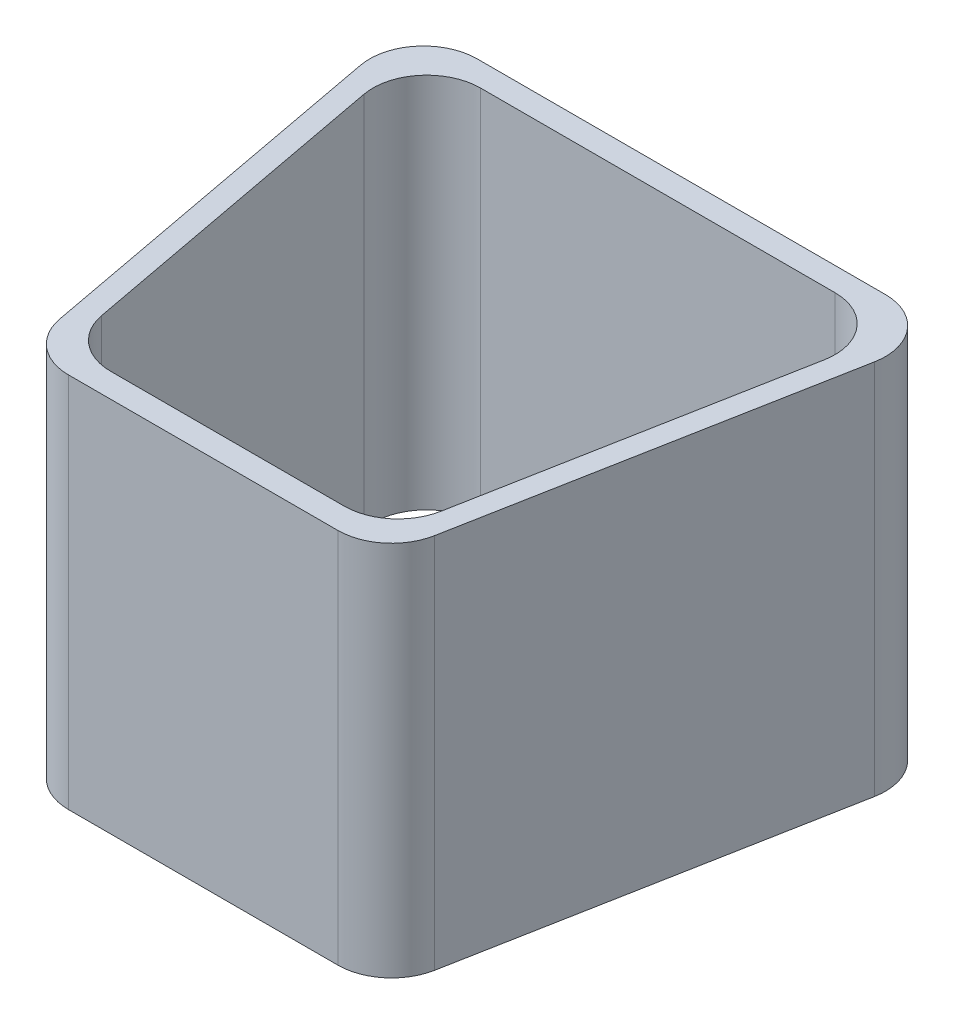
ISO-10303-21;
HEADER;
FILE_DESCRIPTION(('STEP AP214'),'2;1');
FILE_NAME('part.step','',(''),(''),'','','');
FILE_SCHEMA(('AUTOMOTIVE_DESIGN { 1 0 10303 214 1 1 1 1 }'));
ENDSEC;
DATA;
#1=APPLICATION_CONTEXT('core data for automotive mechanical design processes');
#2=APPLICATION_PROTOCOL_DEFINITION('international standard','automotive_design',2000,#1);
#3=PRODUCT_CONTEXT('',#1,'mechanical');
#4=PRODUCT('Part','Part','',(#3));
#5=PRODUCT_RELATED_PRODUCT_CATEGORY('part','',(#4));
#6=PRODUCT_DEFINITION_FORMATION('','',#4);
#7=PRODUCT_DEFINITION_CONTEXT('part definition',#1,'design');
#8=PRODUCT_DEFINITION('design','',#6,#7);
#9=PRODUCT_DEFINITION_SHAPE('','',#8);
#10=(LENGTH_UNIT() NAMED_UNIT(*) SI_UNIT(.MILLI.,.METRE.));
#11=(NAMED_UNIT(*) PLANE_ANGLE_UNIT() SI_UNIT($,.RADIAN.));
#12=(NAMED_UNIT(*) SI_UNIT($,.STERADIAN.) SOLID_ANGLE_UNIT());
#13=UNCERTAINTY_MEASURE_WITH_UNIT(LENGTH_MEASURE(1.E-05),#10,'distance_accuracy_value','');
#14=(GEOMETRIC_REPRESENTATION_CONTEXT(3) GLOBAL_UNCERTAINTY_ASSIGNED_CONTEXT((#13)) GLOBAL_UNIT_ASSIGNED_CONTEXT((#10,
#11,#12)) REPRESENTATION_CONTEXT('',''));
#15=CARTESIAN_POINT('',(0.,0.,0.));
#16=DIRECTION('',(0.,0.,1.));
#17=DIRECTION('',(1.,0.,0.));
#18=AXIS2_PLACEMENT_3D('',#15,#16,#17);
#19=CARTESIAN_POINT('',(6.35865389703584,8.89,8.763));
#20=DIRECTION('',(0.,-1.,0.));
#21=DIRECTION('',(0.,0.,-1.));
#22=AXIS2_PLACEMENT_3D('',#19,#20,#21);
#23=CYLINDRICAL_SURFACE('',#22,2.54);
#24=CARTESIAN_POINT('',(6.35865389703584,-8.89,8.763));
#25=DIRECTION('',(0.,1.,0.));
#26=DIRECTION('',(0.,0.,1.));
#27=AXIS2_PLACEMENT_3D('',#24,#25,#26);
#28=CIRCLE('',#27,2.54);
#29=CARTESIAN_POINT('',(6.35865389703584,-8.89,11.303));
#30=VERTEX_POINT('',#29);
#31=CARTESIAN_POINT('',(8.85514925184902,-8.89,9.23109287902747));
#32=VERTEX_POINT('',#31);
#33=EDGE_CURVE('E210',#30,#32,#28,.T.);
#34=ORIENTED_EDGE('',*,*,#33,.T.);
#35=DIRECTION('',(0.,-1.,0.));
#36=VECTOR('',#35,1.);
#37=CARTESIAN_POINT('',(8.85514925184902,8.89,9.23109287902747));
#38=LINE('',#37,#36);
#39=CARTESIAN_POINT('',(8.85514925184902,8.89,9.23109287902747));
#40=VERTEX_POINT('',#39);
#41=EDGE_CURVE('E11',#40,#32,#38,.T.);
#42=ORIENTED_EDGE('',*,*,#41,.F.);
#43=CARTESIAN_POINT('',(6.35865389703584,8.89,8.763));
#44=DIRECTION('',(0.,1.,0.));
#45=DIRECTION('',(0.,0.,1.));
#46=AXIS2_PLACEMENT_3D('',#43,#44,#45);
#47=CIRCLE('',#46,2.54);
#48=CARTESIAN_POINT('',(6.35865389703584,8.89,11.303));
#49=VERTEX_POINT('',#48);
#50=EDGE_CURVE('E222',#49,#40,#47,.T.);
#51=ORIENTED_EDGE('',*,*,#50,.F.);
#52=DIRECTION('',(0.,-1.,0.));
#53=VECTOR('',#52,1.);
#54=CARTESIAN_POINT('',(6.35865389703584,8.89,11.303));
#55=LINE('',#54,#53);
#56=EDGE_CURVE('E240',#49,#30,#55,.T.);
#57=ORIENTED_EDGE('',*,*,#56,.T.);
#58=EDGE_LOOP('',(#34,#42,#51,#57));
#59=FACE_BOUND('',#58,.T.);
#60=ADVANCED_FACE('F41',(#59),#23,.T.);
#61=CARTESIAN_POINT('',(8.85514925184902,8.89,9.23109287902747));
#62=DIRECTION('',(-0.982872186934322,0.,-0.184288535050185));
#63=DIRECTION('',(-0.184288535050185,0.,0.982872186934322));
#64=AXIS2_PLACEMENT_3D('',#61,#62,#63);
#65=PLANE('',#64);
#66=DIRECTION('',(0.184288535050185,0.,-0.982872186934322));
#67=VECTOR('',#66,1.);
#68=CARTESIAN_POINT('',(8.85514925184902,-8.89,9.23109287902747));
#69=LINE('',#68,#67);
#70=CARTESIAN_POINT('',(12.1359825851823,-8.89,-8.26668489875031));
#71=VERTEX_POINT('',#70);
#72=EDGE_CURVE('E243',#32,#71,#69,.T.);
#73=ORIENTED_EDGE('',*,*,#72,.T.);
#74=DIRECTION('',(0.,-1.,0.));
#75=VECTOR('',#74,1.);
#76=CARTESIAN_POINT('',(12.1359825851823,8.89,-8.26668489875031));
#77=LINE('',#76,#75);
#78=CARTESIAN_POINT('',(12.1359825851823,8.89,-8.26668489875031));
#79=VERTEX_POINT('',#78);
#80=EDGE_CURVE('E48',#79,#71,#77,.T.);
#81=ORIENTED_EDGE('',*,*,#80,.F.);
#82=DIRECTION('',(0.184288535050185,0.,-0.982872186934322));
#83=VECTOR('',#82,1.);
#84=CARTESIAN_POINT('',(8.85514925184902,8.89,9.23109287902747));
#85=LINE('',#84,#83);
#86=EDGE_CURVE('E225',#40,#79,#85,.T.);
#87=ORIENTED_EDGE('',*,*,#86,.F.);
#88=ORIENTED_EDGE('',*,*,#41,.T.);
#89=EDGE_LOOP('',(#73,#81,#87,#88));
#90=FACE_BOUND('',#89,.T.);
#91=ADVANCED_FACE('F298',(#90),#65,.F.);
#92=CARTESIAN_POINT('',(9.63948723036916,8.89,-8.73477777777778));
#93=DIRECTION('',(0.,-1.,0.));
#94=DIRECTION('',(0.,0.,-1.));
#95=AXIS2_PLACEMENT_3D('',#92,#93,#94);
#96=CYLINDRICAL_SURFACE('',#95,2.54);
#97=CARTESIAN_POINT('',(9.63948723036916,-8.89,-8.73477777777778));
#98=DIRECTION('',(0.,1.,0.));
#99=DIRECTION('',(0.,0.,1.));
#100=AXIS2_PLACEMENT_3D('',#97,#98,#99);
#101=CIRCLE('',#100,2.54);
#102=CARTESIAN_POINT('',(9.63948723036916,-8.89,-11.2747777777778));
#103=VERTEX_POINT('',#102);
#104=EDGE_CURVE('E245',#71,#103,#101,.T.);
#105=ORIENTED_EDGE('',*,*,#104,.T.);
#106=DIRECTION('',(0.,-1.,0.));
#107=VECTOR('',#106,1.);
#108=CARTESIAN_POINT('',(9.63948723036916,8.89,-11.2747777777778));
#109=LINE('',#108,#107);
#110=CARTESIAN_POINT('',(9.63948723036916,8.89,-11.2747777777778));
#111=VERTEX_POINT('',#110);
#112=EDGE_CURVE('E270',#111,#103,#109,.T.);
#113=ORIENTED_EDGE('',*,*,#112,.F.);
#114=CARTESIAN_POINT('',(9.63948723036916,8.89,-8.73477777777778));
#115=DIRECTION('',(0.,1.,0.));
#116=DIRECTION('',(0.,0.,1.));
#117=AXIS2_PLACEMENT_3D('',#114,#115,#116);
#118=CIRCLE('',#117,2.54);
#119=EDGE_CURVE('E228',#79,#111,#118,.T.);
#120=ORIENTED_EDGE('',*,*,#119,.F.);
#121=ORIENTED_EDGE('',*,*,#80,.T.);
#122=EDGE_LOOP('',(#105,#113,#120,#121));
#123=FACE_BOUND('',#122,.T.);
#124=ADVANCED_FACE('F277',(#123),#96,.T.);
#125=CARTESIAN_POINT('',(-9.63948723036917,8.89,-11.2747777777778));
#126=DIRECTION('',(0.,0.,1.));
#127=DIRECTION('',(1.,0.,0.));
#128=AXIS2_PLACEMENT_3D('',#125,#126,#127);
#129=PLANE('',#128);
#130=DIRECTION('',(-1.,0.,0.));
#131=VECTOR('',#130,1.);
#132=CARTESIAN_POINT('',(-9.63948723036917,-8.89,-11.2747777777778));
#133=LINE('',#132,#131);
#134=CARTESIAN_POINT('',(-9.63948723036917,-8.89,-11.2747777777778));
#135=VERTEX_POINT('',#134);
#136=EDGE_CURVE('E247',#103,#135,#133,.T.);
#137=ORIENTED_EDGE('',*,*,#136,.T.);
#138=DIRECTION('',(0.,-1.,0.));
#139=VECTOR('',#138,1.);
#140=CARTESIAN_POINT('',(-9.63948723036917,8.89,-11.2747777777778));
#141=LINE('',#140,#139);
#142=CARTESIAN_POINT('',(-9.63948723036917,8.89,-11.2747777777778));
#143=VERTEX_POINT('',#142);
#144=EDGE_CURVE('E267',#143,#135,#141,.T.);
#145=ORIENTED_EDGE('',*,*,#144,.F.);
#146=DIRECTION('',(-1.,0.,0.));
#147=VECTOR('',#146,1.);
#148=CARTESIAN_POINT('',(-9.63948723036917,8.89,-11.2747777777778));
#149=LINE('',#148,#147);
#150=EDGE_CURVE('E230',#111,#143,#149,.T.);
#151=ORIENTED_EDGE('',*,*,#150,.F.);
#152=ORIENTED_EDGE('',*,*,#112,.T.);
#153=EDGE_LOOP('',(#137,#145,#151,#152));
#154=FACE_BOUND('',#153,.T.);
#155=ADVANCED_FACE('F286',(#154),#129,.F.);
#156=CARTESIAN_POINT('',(-9.63948723036917,8.89,-8.73477777777778));
#157=DIRECTION('',(0.,-1.,0.));
#158=DIRECTION('',(0.,0.,-1.));
#159=AXIS2_PLACEMENT_3D('',#156,#157,#158);
#160=CYLINDRICAL_SURFACE('',#159,2.54);
#161=CARTESIAN_POINT('',(-9.63948723036917,-8.89,-8.73477777777778));
#162=DIRECTION('',(0.,1.,0.));
#163=DIRECTION('',(0.,0.,-1.));
#164=AXIS2_PLACEMENT_3D('',#161,#162,#163);
#165=CIRCLE('',#164,2.54);
#166=CARTESIAN_POINT('',(-12.1359825851824,-8.89,-8.2666848987503));
#167=VERTEX_POINT('',#166);
#168=EDGE_CURVE('E249',#135,#167,#165,.T.);
#169=ORIENTED_EDGE('',*,*,#168,.T.);
#170=DIRECTION('',(0.,-1.,0.));
#171=VECTOR('',#170,1.);
#172=CARTESIAN_POINT('',(-12.1359825851824,8.89,-8.2666848987503));
#173=LINE('',#172,#171);
#174=CARTESIAN_POINT('',(-12.1359825851824,8.89,-8.2666848987503));
#175=VERTEX_POINT('',#174);
#176=EDGE_CURVE('E264',#175,#167,#173,.T.);
#177=ORIENTED_EDGE('',*,*,#176,.F.);
#178=CARTESIAN_POINT('',(-9.63948723036917,8.89,-8.73477777777778));
#179=DIRECTION('',(0.,1.,0.));
#180=DIRECTION('',(0.,0.,-1.));
#181=AXIS2_PLACEMENT_3D('',#178,#179,#180);
#182=CIRCLE('',#181,2.54);
#183=EDGE_CURVE('E232',#143,#175,#182,.T.);
#184=ORIENTED_EDGE('',*,*,#183,.F.);
#185=ORIENTED_EDGE('',*,*,#144,.T.);
#186=EDGE_LOOP('',(#169,#177,#184,#185));
#187=FACE_BOUND('',#186,.T.);
#188=ADVANCED_FACE('F290',(#187),#160,.T.);
#189=CARTESIAN_POINT('',(-8.85514925184902,8.89,9.23109287902747));
#190=DIRECTION('',(0.982872186934322,0.,-0.184288535050185));
#191=DIRECTION('',(-0.184288535050185,0.,-0.982872186934322));
#192=AXIS2_PLACEMENT_3D('',#189,#190,#191);
#193=PLANE('',#192);
#194=DIRECTION('',(0.184288535050185,0.,0.982872186934322));
#195=VECTOR('',#194,1.);
#196=CARTESIAN_POINT('',(-8.85514925184902,-8.89,9.23109287902747));
#197=LINE('',#196,#195);
#198=CARTESIAN_POINT('',(-8.85514925184901,-8.89,9.23109287902747));
#199=VERTEX_POINT('',#198);
#200=EDGE_CURVE('E251',#167,#199,#197,.T.);
#201=ORIENTED_EDGE('',*,*,#200,.T.);
#202=DIRECTION('',(0.,-1.,0.));
#203=VECTOR('',#202,1.);
#204=CARTESIAN_POINT('',(-8.85514925184901,8.89,9.23109287902747));
#205=LINE('',#204,#203);
#206=CARTESIAN_POINT('',(-8.85514925184901,8.89,9.23109287902747));
#207=VERTEX_POINT('',#206);
#208=EDGE_CURVE('E261',#207,#199,#205,.T.);
#209=ORIENTED_EDGE('',*,*,#208,.F.);
#210=DIRECTION('',(0.184288535050185,0.,0.982872186934322));
#211=VECTOR('',#210,1.);
#212=CARTESIAN_POINT('',(-8.85514925184902,8.89,9.23109287902747));
#213=LINE('',#212,#211);
#214=EDGE_CURVE('E234',#175,#207,#213,.T.);
#215=ORIENTED_EDGE('',*,*,#214,.F.);
#216=ORIENTED_EDGE('',*,*,#176,.T.);
#217=EDGE_LOOP('',(#201,#209,#215,#216));
#218=FACE_BOUND('',#217,.T.);
#219=ADVANCED_FACE('F311',(#218),#193,.F.);
#220=CARTESIAN_POINT('',(-6.35865389703584,8.89,8.763));
#221=DIRECTION('',(0.,-1.,0.));
#222=DIRECTION('',(0.,0.,-1.));
#223=AXIS2_PLACEMENT_3D('',#220,#221,#222);
#224=CYLINDRICAL_SURFACE('',#223,2.54);
#225=CARTESIAN_POINT('',(-6.35865389703584,-8.89,8.763));
#226=DIRECTION('',(0.,1.,0.));
#227=DIRECTION('',(0.,0.,-1.));
#228=AXIS2_PLACEMENT_3D('',#225,#226,#227);
#229=CIRCLE('',#228,2.54);
#230=CARTESIAN_POINT('',(-6.35865389703584,-8.89,11.303));
#231=VERTEX_POINT('',#230);
#232=EDGE_CURVE('E253',#199,#231,#229,.T.);
#233=ORIENTED_EDGE('',*,*,#232,.T.);
#234=DIRECTION('',(0.,-1.,0.));
#235=VECTOR('',#234,1.);
#236=CARTESIAN_POINT('',(-6.35865389703584,8.89,11.303));
#237=LINE('',#236,#235);
#238=CARTESIAN_POINT('',(-6.35865389703584,8.89,11.303));
#239=VERTEX_POINT('',#238);
#240=EDGE_CURVE('E258',#239,#231,#237,.T.);
#241=ORIENTED_EDGE('',*,*,#240,.F.);
#242=CARTESIAN_POINT('',(-6.35865389703584,8.89,8.763));
#243=DIRECTION('',(0.,1.,0.));
#244=DIRECTION('',(0.,0.,-1.));
#245=AXIS2_PLACEMENT_3D('',#242,#243,#244);
#246=CIRCLE('',#245,2.54);
#247=EDGE_CURVE('E236',#207,#239,#246,.T.);
#248=ORIENTED_EDGE('',*,*,#247,.F.);
#249=ORIENTED_EDGE('',*,*,#208,.T.);
#250=EDGE_LOOP('',(#233,#241,#248,#249));
#251=FACE_BOUND('',#250,.T.);
#252=ADVANCED_FACE('F309',(#251),#224,.T.);
#253=CARTESIAN_POINT('',(-6.35865389703584,8.89,11.303));
#254=DIRECTION('',(0.,0.,-1.));
#255=DIRECTION('',(-1.,0.,0.));
#256=AXIS2_PLACEMENT_3D('',#253,#254,#255);
#257=PLANE('',#256);
#258=DIRECTION('',(1.,0.,0.));
#259=VECTOR('',#258,1.);
#260=CARTESIAN_POINT('',(-6.35865389703584,-8.89,11.303));
#261=LINE('',#260,#259);
#262=EDGE_CURVE('E226',#231,#30,#261,.T.);
#263=ORIENTED_EDGE('',*,*,#262,.T.);
#264=ORIENTED_EDGE('',*,*,#56,.F.);
#265=DIRECTION('',(1.,0.,0.));
#266=VECTOR('',#265,1.);
#267=CARTESIAN_POINT('',(-6.35865389703584,8.89,11.303));
#268=LINE('',#267,#266);
#269=EDGE_CURVE('E238',#239,#49,#268,.T.);
#270=ORIENTED_EDGE('',*,*,#269,.F.);
#271=ORIENTED_EDGE('',*,*,#240,.T.);
#272=EDGE_LOOP('',(#263,#264,#270,#271));
#273=FACE_BOUND('',#272,.T.);
#274=ADVANCED_FACE('F304',(#273),#257,.F.);
#275=CARTESIAN_POINT('',(6.35865389703584,8.89,8.763));
#276=DIRECTION('',(0.,1.,0.));
#277=DIRECTION('',(0.,0.,1.));
#278=AXIS2_PLACEMENT_3D('',#275,#276,#277);
#279=PLANE('',#278);
#280=CARTESIAN_POINT('',(8.36948723036917,8.89,-7.62));
#281=DIRECTION('',(0.,1.,0.));
#282=DIRECTION('',(0.,0.,1.));
#283=AXIS2_PLACEMENT_3D('',#280,#281,#282);
#284=CIRCLE('',#283,2.54);
#285=CARTESIAN_POINT('',(10.8659825851823,8.89,-7.15190712097251));
#286=VERTEX_POINT('',#285);
#287=CARTESIAN_POINT('',(8.36948723036915,8.89,-10.16));
#288=VERTEX_POINT('',#287);
#289=EDGE_CURVE('E55',#286,#288,#284,.T.);
#290=ORIENTED_EDGE('',*,*,#289,.F.);
#291=DIRECTION('',(0.184288535050185,0.,-0.982872186934322));
#292=VECTOR('',#291,1.);
#293=CARTESIAN_POINT('',(10.8659825851823,8.89,-7.15190712097251));
#294=LINE('',#293,#292);
#295=CARTESIAN_POINT('',(8.00848258518235,8.89,8.08809287902745));
#296=VERTEX_POINT('',#295);
#297=EDGE_CURVE('E172',#296,#286,#294,.T.);
#298=ORIENTED_EDGE('',*,*,#297,.F.);
#299=CARTESIAN_POINT('',(5.51198723036917,8.89,7.62));
#300=DIRECTION('',(0.,1.,0.));
#301=DIRECTION('',(0.,0.,1.));
#302=AXIS2_PLACEMENT_3D('',#299,#300,#301);
#303=CIRCLE('',#302,2.54);
#304=CARTESIAN_POINT('',(5.51198723036915,8.89,10.16));
#305=VERTEX_POINT('',#304);
#306=EDGE_CURVE('E175',#305,#296,#303,.T.);
#307=ORIENTED_EDGE('',*,*,#306,.F.);
#308=DIRECTION('',(1.,0.,0.));
#309=VECTOR('',#308,1.);
#310=CARTESIAN_POINT('',(5.51198723036916,8.89,10.16));
#311=LINE('',#310,#309);
#312=CARTESIAN_POINT('',(-5.51198723036916,8.89,10.16));
#313=VERTEX_POINT('',#312);
#314=EDGE_CURVE('E203',#313,#305,#311,.T.);
#315=ORIENTED_EDGE('',*,*,#314,.F.);
#316=CARTESIAN_POINT('',(-5.51198723036917,8.89,7.62));
#317=DIRECTION('',(0.,1.,0.));
#318=DIRECTION('',(0.,0.,-1.));
#319=AXIS2_PLACEMENT_3D('',#316,#317,#318);
#320=CIRCLE('',#319,2.54);
#321=CARTESIAN_POINT('',(-8.00848258518235,8.89,8.08809287902746));
#322=VERTEX_POINT('',#321);
#323=EDGE_CURVE('E200',#322,#313,#320,.T.);
#324=ORIENTED_EDGE('',*,*,#323,.F.);
#325=DIRECTION('',(0.184288535050185,0.,0.982872186934322));
#326=VECTOR('',#325,1.);
#327=CARTESIAN_POINT('',(-10.8659825851823,8.89,-7.15190712097251));
#328=LINE('',#327,#326);
#329=CARTESIAN_POINT('',(-10.8659825851823,8.89,-7.15190712097251));
#330=VERTEX_POINT('',#329);
#331=EDGE_CURVE('E197',#330,#322,#328,.T.);
#332=ORIENTED_EDGE('',*,*,#331,.F.);
#333=CARTESIAN_POINT('',(-8.36948723036917,8.89,-7.62));
#334=DIRECTION('',(0.,1.,0.));
#335=DIRECTION('',(0.,0.,-1.));
#336=AXIS2_PLACEMENT_3D('',#333,#334,#335);
#337=CIRCLE('',#336,2.54);
#338=CARTESIAN_POINT('',(-8.36948723036917,8.89,-10.16));
#339=VERTEX_POINT('',#338);
#340=EDGE_CURVE('E194',#339,#330,#337,.T.);
#341=ORIENTED_EDGE('',*,*,#340,.F.);
#342=DIRECTION('',(-1.,0.,0.));
#343=VECTOR('',#342,1.);
#344=CARTESIAN_POINT('',(-8.36948723036915,8.89,-10.16));
#345=LINE('',#344,#343);
#346=EDGE_CURVE('E192',#288,#339,#345,.T.);
#347=ORIENTED_EDGE('',*,*,#346,.F.);
#348=EDGE_LOOP('',(#290,#298,#307,#315,#324,#332,#341,#347));
#349=FACE_BOUND('',#348,.T.);
#350=ORIENTED_EDGE('',*,*,#50,.T.);
#351=ORIENTED_EDGE('',*,*,#86,.T.);
#352=ORIENTED_EDGE('',*,*,#119,.T.);
#353=ORIENTED_EDGE('',*,*,#150,.T.);
#354=ORIENTED_EDGE('',*,*,#183,.T.);
#355=ORIENTED_EDGE('',*,*,#214,.T.);
#356=ORIENTED_EDGE('',*,*,#247,.T.);
#357=ORIENTED_EDGE('',*,*,#269,.T.);
#358=EDGE_LOOP('',(#350,#351,#352,#353,#354,#355,#356,#357));
#359=FACE_BOUND('',#358,.T.);
#360=ADVANCED_FACE('F294',(#349,#359),#279,.T.);
#361=CARTESIAN_POINT('',(6.35865389703584,-8.89,8.763));
#362=DIRECTION('',(0.,1.,0.));
#363=DIRECTION('',(0.,0.,1.));
#364=AXIS2_PLACEMENT_3D('',#361,#362,#363);
#365=PLANE('',#364);
#366=DIRECTION('',(0.184288535050185,0.,-0.982872186934322));
#367=VECTOR('',#366,1.);
#368=CARTESIAN_POINT('',(10.8659825851823,-8.89,-7.15190712097251));
#369=LINE('',#368,#367);
#370=CARTESIAN_POINT('',(8.00848258518235,-8.89,8.08809287902745));
#371=VERTEX_POINT('',#370);
#372=CARTESIAN_POINT('',(10.8659825851823,-8.89,-7.15190712097251));
#373=VERTEX_POINT('',#372);
#374=EDGE_CURVE('E161',#371,#373,#369,.T.);
#375=ORIENTED_EDGE('',*,*,#374,.T.);
#376=CARTESIAN_POINT('',(8.36948723036917,-8.89,-7.62));
#377=DIRECTION('',(0.,1.,0.));
#378=DIRECTION('',(0.,0.,1.));
#379=AXIS2_PLACEMENT_3D('',#376,#377,#378);
#380=CIRCLE('',#379,2.54);
#381=CARTESIAN_POINT('',(8.36948723036915,-8.89,-10.16));
#382=VERTEX_POINT('',#381);
#383=EDGE_CURVE('E155',#373,#382,#380,.T.);
#384=ORIENTED_EDGE('',*,*,#383,.T.);
#385=DIRECTION('',(-1.,0.,0.));
#386=VECTOR('',#385,1.);
#387=CARTESIAN_POINT('',(-8.36948723036915,-8.89,-10.16));
#388=LINE('',#387,#386);
#389=CARTESIAN_POINT('',(-8.36948723036917,-8.89,-10.16));
#390=VERTEX_POINT('',#389);
#391=EDGE_CURVE('E164',#382,#390,#388,.T.);
#392=ORIENTED_EDGE('',*,*,#391,.T.);
#393=CARTESIAN_POINT('',(-8.36948723036917,-8.89,-7.62));
#394=DIRECTION('',(0.,1.,0.));
#395=DIRECTION('',(0.,0.,-1.));
#396=AXIS2_PLACEMENT_3D('',#393,#394,#395);
#397=CIRCLE('',#396,2.54);
#398=CARTESIAN_POINT('',(-10.8659825851823,-8.89,-7.15190712097251));
#399=VERTEX_POINT('',#398);
#400=EDGE_CURVE('E63',#390,#399,#397,.T.);
#401=ORIENTED_EDGE('',*,*,#400,.T.);
#402=DIRECTION('',(0.184288535050185,0.,0.982872186934322));
#403=VECTOR('',#402,1.);
#404=CARTESIAN_POINT('',(-10.8659825851823,-8.89,-7.15190712097251));
#405=LINE('',#404,#403);
#406=CARTESIAN_POINT('',(-8.00848258518235,-8.89,8.08809287902746));
#407=VERTEX_POINT('',#406);
#408=EDGE_CURVE('E179',#399,#407,#405,.T.);
#409=ORIENTED_EDGE('',*,*,#408,.T.);
#410=CARTESIAN_POINT('',(-5.51198723036917,-8.89,7.62));
#411=DIRECTION('',(0.,1.,0.));
#412=DIRECTION('',(0.,0.,-1.));
#413=AXIS2_PLACEMENT_3D('',#410,#411,#412);
#414=CIRCLE('',#413,2.54);
#415=CARTESIAN_POINT('',(-5.51198723036916,-8.89,10.16));
#416=VERTEX_POINT('',#415);
#417=EDGE_CURVE('E182',#407,#416,#414,.T.);
#418=ORIENTED_EDGE('',*,*,#417,.T.);
#419=DIRECTION('',(1.,0.,0.));
#420=VECTOR('',#419,1.);
#421=CARTESIAN_POINT('',(5.51198723036916,-8.89,10.16));
#422=LINE('',#421,#420);
#423=CARTESIAN_POINT('',(5.51198723036915,-8.89,10.16));
#424=VERTEX_POINT('',#423);
#425=EDGE_CURVE('E185',#416,#424,#422,.T.);
#426=ORIENTED_EDGE('',*,*,#425,.T.);
#427=CARTESIAN_POINT('',(5.51198723036917,-8.89,7.62));
#428=DIRECTION('',(0.,1.,0.));
#429=DIRECTION('',(0.,0.,1.));
#430=AXIS2_PLACEMENT_3D('',#427,#428,#429);
#431=CIRCLE('',#430,2.54);
#432=EDGE_CURVE('E188',#424,#371,#431,.T.);
#433=ORIENTED_EDGE('',*,*,#432,.T.);
#434=EDGE_LOOP('',(#375,#384,#392,#401,#409,#418,#426,#433));
#435=FACE_BOUND('',#434,.T.);
#436=ORIENTED_EDGE('',*,*,#33,.F.);
#437=ORIENTED_EDGE('',*,*,#262,.F.);
#438=ORIENTED_EDGE('',*,*,#232,.F.);
#439=ORIENTED_EDGE('',*,*,#200,.F.);
#440=ORIENTED_EDGE('',*,*,#168,.F.);
#441=ORIENTED_EDGE('',*,*,#136,.F.);
#442=ORIENTED_EDGE('',*,*,#104,.F.);
#443=ORIENTED_EDGE('',*,*,#72,.F.);
#444=EDGE_LOOP('',(#436,#437,#438,#439,#440,#441,#442,#443));
#445=FACE_BOUND('',#444,.T.);
#446=ADVANCED_FACE('F168',(#435,#445),#365,.F.);
#447=CARTESIAN_POINT('',(8.36948723036917,-8.89,-7.62));
#448=DIRECTION('',(0.,1.,0.));
#449=DIRECTION('',(0.,0.,1.));
#450=AXIS2_PLACEMENT_3D('',#447,#448,#449);
#451=CYLINDRICAL_SURFACE('',#450,2.54);
#452=ORIENTED_EDGE('',*,*,#289,.T.);
#453=DIRECTION('',(0.,1.,0.));
#454=VECTOR('',#453,1.);
#455=CARTESIAN_POINT('',(8.36948723036915,-8.89,-10.16));
#456=LINE('',#455,#454);
#457=EDGE_CURVE('E151',#382,#288,#456,.T.);
#458=ORIENTED_EDGE('',*,*,#457,.F.);
#459=ORIENTED_EDGE('',*,*,#383,.F.);
#460=DIRECTION('',(0.,1.,0.));
#461=VECTOR('',#460,1.);
#462=CARTESIAN_POINT('',(10.8659825851823,-8.89,-7.15190712097251));
#463=LINE('',#462,#461);
#464=EDGE_CURVE('E208',#373,#286,#463,.T.);
#465=ORIENTED_EDGE('',*,*,#464,.T.);
#466=EDGE_LOOP('',(#452,#458,#459,#465));
#467=FACE_BOUND('',#466,.T.);
#468=ADVANCED_FACE('F153',(#467),#451,.F.);
#469=CARTESIAN_POINT('',(10.8659825851823,-8.89,-7.15190712097251));
#470=DIRECTION('',(0.982872186934322,0.,0.184288535050185));
#471=DIRECTION('',(0.184288535050185,0.,-0.982872186934322));
#472=AXIS2_PLACEMENT_3D('',#469,#470,#471);
#473=PLANE('',#472);
#474=ORIENTED_EDGE('',*,*,#297,.T.);
#475=ORIENTED_EDGE('',*,*,#464,.F.);
#476=ORIENTED_EDGE('',*,*,#374,.F.);
#477=DIRECTION('',(0.,1.,0.));
#478=VECTOR('',#477,1.);
#479=CARTESIAN_POINT('',(8.00848258518235,-8.89,8.08809287902745));
#480=LINE('',#479,#478);
#481=EDGE_CURVE('E211',#371,#296,#480,.T.);
#482=ORIENTED_EDGE('',*,*,#481,.T.);
#483=EDGE_LOOP('',(#474,#475,#476,#482));
#484=FACE_BOUND('',#483,.T.);
#485=ADVANCED_FACE('F384',(#484),#473,.F.);
#486=CARTESIAN_POINT('',(5.51198723036917,-8.89,7.62));
#487=DIRECTION('',(0.,1.,0.));
#488=DIRECTION('',(0.,0.,1.));
#489=AXIS2_PLACEMENT_3D('',#486,#487,#488);
#490=CYLINDRICAL_SURFACE('',#489,2.54);
#491=ORIENTED_EDGE('',*,*,#306,.T.);
#492=ORIENTED_EDGE('',*,*,#481,.F.);
#493=ORIENTED_EDGE('',*,*,#432,.F.);
#494=DIRECTION('',(0.,1.,0.));
#495=VECTOR('',#494,1.);
#496=CARTESIAN_POINT('',(5.51198723036915,-8.89,10.16));
#497=LINE('',#496,#495);
#498=EDGE_CURVE('E213',#424,#305,#497,.T.);
#499=ORIENTED_EDGE('',*,*,#498,.T.);
#500=EDGE_LOOP('',(#491,#492,#493,#499));
#501=FACE_BOUND('',#500,.T.);
#502=ADVANCED_FACE('F393',(#501),#490,.F.);
#503=CARTESIAN_POINT('',(5.51198723036916,-8.89,10.16));
#504=DIRECTION('',(0.,0.,1.));
#505=DIRECTION('',(1.,0.,0.));
#506=AXIS2_PLACEMENT_3D('',#503,#504,#505);
#507=PLANE('',#506);
#508=ORIENTED_EDGE('',*,*,#314,.T.);
#509=ORIENTED_EDGE('',*,*,#498,.F.);
#510=ORIENTED_EDGE('',*,*,#425,.F.);
#511=DIRECTION('',(0.,1.,0.));
#512=VECTOR('',#511,1.);
#513=CARTESIAN_POINT('',(-5.51198723036916,-8.89,10.16));
#514=LINE('',#513,#512);
#515=EDGE_CURVE('E215',#416,#313,#514,.T.);
#516=ORIENTED_EDGE('',*,*,#515,.T.);
#517=EDGE_LOOP('',(#508,#509,#510,#516));
#518=FACE_BOUND('',#517,.T.);
#519=ADVANCED_FACE('F403',(#518),#507,.F.);
#520=CARTESIAN_POINT('',(-5.51198723036917,-8.89,7.62));
#521=DIRECTION('',(0.,1.,0.));
#522=DIRECTION('',(0.,0.,1.));
#523=AXIS2_PLACEMENT_3D('',#520,#521,#522);
#524=CYLINDRICAL_SURFACE('',#523,2.54);
#525=ORIENTED_EDGE('',*,*,#323,.T.);
#526=ORIENTED_EDGE('',*,*,#515,.F.);
#527=ORIENTED_EDGE('',*,*,#417,.F.);
#528=DIRECTION('',(0.,1.,0.));
#529=VECTOR('',#528,1.);
#530=CARTESIAN_POINT('',(-8.00848258518235,-8.89,8.08809287902746));
#531=LINE('',#530,#529);
#532=EDGE_CURVE('E217',#407,#322,#531,.T.);
#533=ORIENTED_EDGE('',*,*,#532,.T.);
#534=EDGE_LOOP('',(#525,#526,#527,#533));
#535=FACE_BOUND('',#534,.T.);
#536=ADVANCED_FACE('F413',(#535),#524,.F.);
#537=CARTESIAN_POINT('',(-10.8659825851823,-8.89,-7.15190712097251));
#538=DIRECTION('',(-0.982872186934322,0.,0.184288535050185));
#539=DIRECTION('',(0.184288535050185,0.,0.982872186934322));
#540=AXIS2_PLACEMENT_3D('',#537,#538,#539);
#541=PLANE('',#540);
#542=ORIENTED_EDGE('',*,*,#331,.T.);
#543=ORIENTED_EDGE('',*,*,#532,.F.);
#544=ORIENTED_EDGE('',*,*,#408,.F.);
#545=DIRECTION('',(0.,1.,0.));
#546=VECTOR('',#545,1.);
#547=CARTESIAN_POINT('',(-10.8659825851823,-8.89,-7.15190712097251));
#548=LINE('',#547,#546);
#549=EDGE_CURVE('E219',#399,#330,#548,.T.);
#550=ORIENTED_EDGE('',*,*,#549,.T.);
#551=EDGE_LOOP('',(#542,#543,#544,#550));
#552=FACE_BOUND('',#551,.T.);
#553=ADVANCED_FACE('F423',(#552),#541,.F.);
#554=CARTESIAN_POINT('',(-8.36948723036917,-8.89,-7.62));
#555=DIRECTION('',(0.,1.,0.));
#556=DIRECTION('',(0.,0.,1.));
#557=AXIS2_PLACEMENT_3D('',#554,#555,#556);
#558=CYLINDRICAL_SURFACE('',#557,2.54);
#559=ORIENTED_EDGE('',*,*,#340,.T.);
#560=ORIENTED_EDGE('',*,*,#549,.F.);
#561=ORIENTED_EDGE('',*,*,#400,.F.);
#562=DIRECTION('',(0.,1.,0.));
#563=VECTOR('',#562,1.);
#564=CARTESIAN_POINT('',(-8.36948723036917,-8.89,-10.16));
#565=LINE('',#564,#563);
#566=EDGE_CURVE('E160',#390,#339,#565,.T.);
#567=ORIENTED_EDGE('',*,*,#566,.T.);
#568=EDGE_LOOP('',(#559,#560,#561,#567));
#569=FACE_BOUND('',#568,.T.);
#570=ADVANCED_FACE('F433',(#569),#558,.F.);
#571=CARTESIAN_POINT('',(-8.36948723036915,-8.89,-10.16));
#572=DIRECTION('',(0.,0.,-1.));
#573=DIRECTION('',(-1.,0.,0.));
#574=AXIS2_PLACEMENT_3D('',#571,#572,#573);
#575=PLANE('',#574);
#576=ORIENTED_EDGE('',*,*,#346,.T.);
#577=ORIENTED_EDGE('',*,*,#566,.F.);
#578=ORIENTED_EDGE('',*,*,#391,.F.);
#579=ORIENTED_EDGE('',*,*,#457,.T.);
#580=EDGE_LOOP('',(#576,#577,#578,#579));
#581=FACE_BOUND('',#580,.T.);
#582=ADVANCED_FACE('F165',(#581),#575,.F.);
#583=CLOSED_SHELL('',(#60,#91,#124,#155,#188,#219,#252,#274,#360,#446,#468,#485,#502,#519,#536,
#553,#570,#582));
#584=MANIFOLD_SOLID_BREP('B2',#583);
#585=ADVANCED_BREP_SHAPE_REPRESENTATION('',(#18,#584),#14);
#586=SHAPE_DEFINITION_REPRESENTATION(#9,#585);
ENDSEC;
END-ISO-10303-21;
